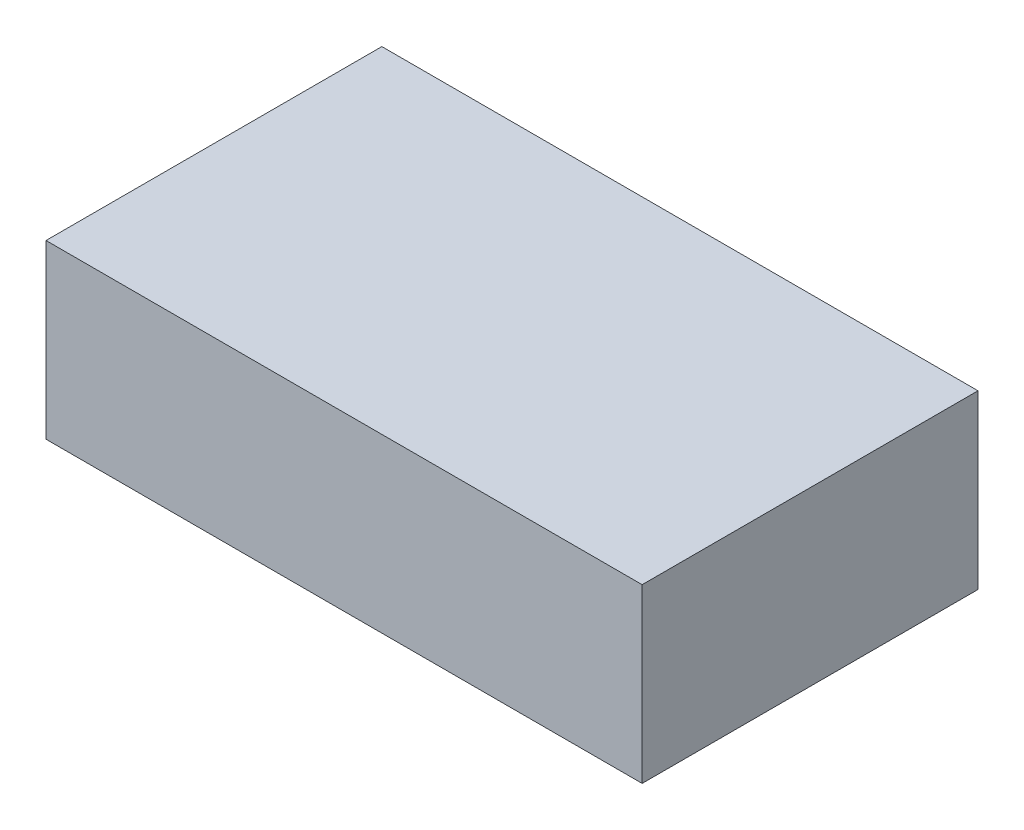
ISO-10303-21;
HEADER;
FILE_DESCRIPTION(('STEP AP214'),'2;1');
FILE_NAME('part.step','',(''),(''),'','','');
FILE_SCHEMA(('AUTOMOTIVE_DESIGN { 1 0 10303 214 1 1 1 1 }'));
ENDSEC;
DATA;
#1=APPLICATION_CONTEXT('core data for automotive mechanical design processes');
#2=APPLICATION_PROTOCOL_DEFINITION('international standard','automotive_design',2000,#1);
#3=PRODUCT_CONTEXT('',#1,'mechanical');
#4=PRODUCT('Part','Part','',(#3));
#5=PRODUCT_RELATED_PRODUCT_CATEGORY('part','',(#4));
#6=PRODUCT_DEFINITION_FORMATION('','',#4);
#7=PRODUCT_DEFINITION_CONTEXT('part definition',#1,'design');
#8=PRODUCT_DEFINITION('design','',#6,#7);
#9=PRODUCT_DEFINITION_SHAPE('','',#8);
#10=(LENGTH_UNIT() NAMED_UNIT(*) SI_UNIT(.MILLI.,.METRE.));
#11=(NAMED_UNIT(*) PLANE_ANGLE_UNIT() SI_UNIT($,.RADIAN.));
#12=(NAMED_UNIT(*) SI_UNIT($,.STERADIAN.) SOLID_ANGLE_UNIT());
#13=UNCERTAINTY_MEASURE_WITH_UNIT(LENGTH_MEASURE(1.E-05),#10,'distance_accuracy_value','');
#14=(GEOMETRIC_REPRESENTATION_CONTEXT(3) GLOBAL_UNCERTAINTY_ASSIGNED_CONTEXT((#13)) GLOBAL_UNIT_ASSIGNED_CONTEXT((#10,
#11,#12)) REPRESENTATION_CONTEXT('',''));
#15=CARTESIAN_POINT('',(0.,0.,0.));
#16=DIRECTION('',(0.,0.,1.));
#17=DIRECTION('',(1.,0.,0.));
#18=AXIS2_PLACEMENT_3D('',#15,#16,#17);
#19=CARTESIAN_POINT('',(71.,41.,-40.));
#20=DIRECTION('',(-1.,0.,0.));
#21=DIRECTION('',(0.,0.,1.));
#22=AXIS2_PLACEMENT_3D('',#19,#20,#21);
#23=PLANE('',#22);
#24=DIRECTION('',(0.,0.,-1.));
#25=VECTOR('',#24,1.);
#26=CARTESIAN_POINT('',(71.,0.,-40.));
#27=LINE('',#26,#25);
#28=CARTESIAN_POINT('',(71.,0.,40.));
#29=VERTEX_POINT('',#28);
#30=CARTESIAN_POINT('',(71.,0.,-40.));
#31=VERTEX_POINT('',#30);
#32=EDGE_CURVE('E102',#29,#31,#27,.T.);
#33=ORIENTED_EDGE('',*,*,#32,.T.);
#34=DIRECTION('',(0.,-1.,0.));
#35=VECTOR('',#34,1.);
#36=CARTESIAN_POINT('',(71.,41.,-40.));
#37=LINE('',#36,#35);
#38=CARTESIAN_POINT('',(71.,41.,-40.));
#39=VERTEX_POINT('',#38);
#40=EDGE_CURVE('E11',#39,#31,#37,.T.);
#41=ORIENTED_EDGE('',*,*,#40,.F.);
#42=DIRECTION('',(0.,0.,-1.));
#43=VECTOR('',#42,1.);
#44=CARTESIAN_POINT('',(71.,41.,-40.));
#45=LINE('',#44,#43);
#46=CARTESIAN_POINT('',(71.,41.,40.));
#47=VERTEX_POINT('',#46);
#48=EDGE_CURVE('E90',#47,#39,#45,.T.);
#49=ORIENTED_EDGE('',*,*,#48,.F.);
#50=DIRECTION('',(0.,-1.,0.));
#51=VECTOR('',#50,1.);
#52=CARTESIAN_POINT('',(71.,41.,40.));
#53=LINE('',#52,#51);
#54=EDGE_CURVE('E98',#47,#29,#53,.T.);
#55=ORIENTED_EDGE('',*,*,#54,.T.);
#56=EDGE_LOOP('',(#33,#41,#49,#55));
#57=FACE_BOUND('',#56,.T.);
#58=ADVANCED_FACE('F39',(#57),#23,.F.);
#59=CARTESIAN_POINT('',(-71.,41.,-40.));
#60=DIRECTION('',(0.,0.,1.));
#61=DIRECTION('',(1.,0.,0.));
#62=AXIS2_PLACEMENT_3D('',#59,#60,#61);
#63=PLANE('',#62);
#64=DIRECTION('',(-1.,0.,0.));
#65=VECTOR('',#64,1.);
#66=CARTESIAN_POINT('',(-71.,0.,-40.));
#67=LINE('',#66,#65);
#68=CARTESIAN_POINT('',(-71.,0.,-40.));
#69=VERTEX_POINT('',#68);
#70=EDGE_CURVE('E94',#31,#69,#67,.T.);
#71=ORIENTED_EDGE('',*,*,#70,.T.);
#72=DIRECTION('',(0.,-1.,0.));
#73=VECTOR('',#72,1.);
#74=CARTESIAN_POINT('',(-71.,41.,-40.));
#75=LINE('',#74,#73);
#76=CARTESIAN_POINT('',(-71.,41.,-40.));
#77=VERTEX_POINT('',#76);
#78=EDGE_CURVE('E47',#77,#69,#75,.T.);
#79=ORIENTED_EDGE('',*,*,#78,.F.);
#80=DIRECTION('',(-1.,0.,0.));
#81=VECTOR('',#80,1.);
#82=CARTESIAN_POINT('',(-71.,41.,-40.));
#83=LINE('',#82,#81);
#84=EDGE_CURVE('E85',#39,#77,#83,.T.);
#85=ORIENTED_EDGE('',*,*,#84,.F.);
#86=ORIENTED_EDGE('',*,*,#40,.T.);
#87=EDGE_LOOP('',(#71,#79,#85,#86));
#88=FACE_BOUND('',#87,.T.);
#89=ADVANCED_FACE('F93',(#88),#63,.F.);
#90=CARTESIAN_POINT('',(-71.,41.,-40.));
#91=DIRECTION('',(1.,0.,0.));
#92=DIRECTION('',(0.,0.,-1.));
#93=AXIS2_PLACEMENT_3D('',#90,#91,#92);
#94=PLANE('',#93);
#95=DIRECTION('',(0.,0.,1.));
#96=VECTOR('',#95,1.);
#97=CARTESIAN_POINT('',(-71.,0.,-40.));
#98=LINE('',#97,#96);
#99=CARTESIAN_POINT('',(-71.,0.,40.));
#100=VERTEX_POINT('',#99);
#101=EDGE_CURVE('E72',#69,#100,#98,.T.);
#102=ORIENTED_EDGE('',*,*,#101,.T.);
#103=DIRECTION('',(0.,-1.,0.));
#104=VECTOR('',#103,1.);
#105=CARTESIAN_POINT('',(-71.,41.,40.));
#106=LINE('',#105,#104);
#107=CARTESIAN_POINT('',(-71.,41.,40.));
#108=VERTEX_POINT('',#107);
#109=EDGE_CURVE('E95',#108,#100,#106,.T.);
#110=ORIENTED_EDGE('',*,*,#109,.F.);
#111=DIRECTION('',(0.,0.,1.));
#112=VECTOR('',#111,1.);
#113=CARTESIAN_POINT('',(-71.,41.,-40.));
#114=LINE('',#113,#112);
#115=EDGE_CURVE('E88',#77,#108,#114,.T.);
#116=ORIENTED_EDGE('',*,*,#115,.F.);
#117=ORIENTED_EDGE('',*,*,#78,.T.);
#118=EDGE_LOOP('',(#102,#110,#116,#117));
#119=FACE_BOUND('',#118,.T.);
#120=ADVANCED_FACE('F96',(#119),#94,.F.);
#121=CARTESIAN_POINT('',(-71.,41.,40.));
#122=DIRECTION('',(0.,0.,-1.));
#123=DIRECTION('',(-1.,0.,0.));
#124=AXIS2_PLACEMENT_3D('',#121,#122,#123);
#125=PLANE('',#124);
#126=DIRECTION('',(1.,0.,0.));
#127=VECTOR('',#126,1.);
#128=CARTESIAN_POINT('',(-71.,0.,40.));
#129=LINE('',#128,#127);
#130=EDGE_CURVE('E78',#100,#29,#129,.T.);
#131=ORIENTED_EDGE('',*,*,#130,.T.);
#132=ORIENTED_EDGE('',*,*,#54,.F.);
#133=DIRECTION('',(1.,0.,0.));
#134=VECTOR('',#133,1.);
#135=CARTESIAN_POINT('',(-71.,41.,40.));
#136=LINE('',#135,#134);
#137=EDGE_CURVE('E55',#108,#47,#136,.T.);
#138=ORIENTED_EDGE('',*,*,#137,.F.);
#139=ORIENTED_EDGE('',*,*,#109,.T.);
#140=EDGE_LOOP('',(#131,#132,#138,#139));
#141=FACE_BOUND('',#140,.T.);
#142=ADVANCED_FACE('F109',(#141),#125,.F.);
#143=CARTESIAN_POINT('',(0.,41.,0.));
#144=DIRECTION('',(0.,1.,0.));
#145=DIRECTION('',(0.,0.,1.));
#146=AXIS2_PLACEMENT_3D('',#143,#144,#145);
#147=PLANE('',#146);
#148=ORIENTED_EDGE('',*,*,#48,.T.);
#149=ORIENTED_EDGE('',*,*,#84,.T.);
#150=ORIENTED_EDGE('',*,*,#115,.T.);
#151=ORIENTED_EDGE('',*,*,#137,.T.);
#152=EDGE_LOOP('',(#148,#149,#150,#151));
#153=FACE_BOUND('',#152,.T.);
#154=ADVANCED_FACE('F86',(#153),#147,.T.);
#155=CARTESIAN_POINT('',(0.,0.,0.));
#156=DIRECTION('',(0.,1.,0.));
#157=DIRECTION('',(0.,0.,1.));
#158=AXIS2_PLACEMENT_3D('',#155,#156,#157);
#159=PLANE('',#158);
#160=ORIENTED_EDGE('',*,*,#32,.F.);
#161=ORIENTED_EDGE('',*,*,#130,.F.);
#162=ORIENTED_EDGE('',*,*,#101,.F.);
#163=ORIENTED_EDGE('',*,*,#70,.F.);
#164=EDGE_LOOP('',(#160,#161,#162,#163));
#165=FACE_BOUND('',#164,.T.);
#166=ADVANCED_FACE('F112',(#165),#159,.F.);
#167=CLOSED_SHELL('',(#58,#89,#120,#142,#154,#166));
#168=MANIFOLD_SOLID_BREP('B2',#167);
#169=ADVANCED_BREP_SHAPE_REPRESENTATION('',(#18,#168),#14);
#170=SHAPE_DEFINITION_REPRESENTATION(#9,#169);
ENDSEC;
END-ISO-10303-21;
